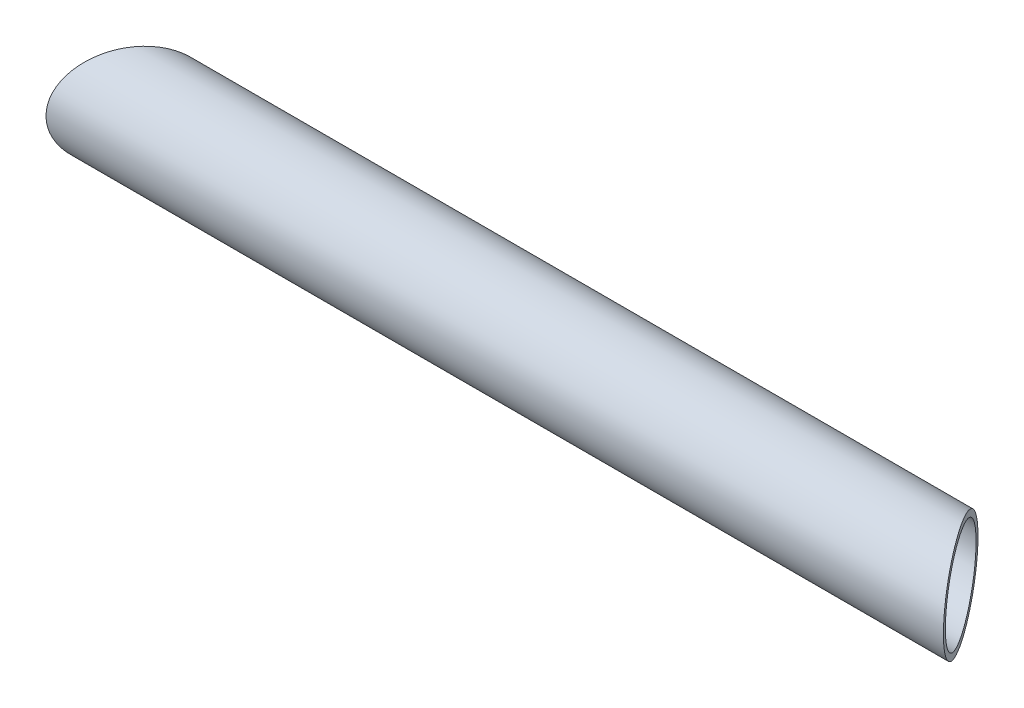
ISO-10303-21;
HEADER;
FILE_DESCRIPTION(('STEP AP214'),'2;1');
FILE_NAME('part.step','',(''),(''),'','','');
FILE_SCHEMA(('AUTOMOTIVE_DESIGN { 1 0 10303 214 1 1 1 1 }'));
ENDSEC;
DATA;
#1=APPLICATION_CONTEXT('core data for automotive mechanical design processes');
#2=APPLICATION_PROTOCOL_DEFINITION('international standard','automotive_design',2000,#1);
#3=PRODUCT_CONTEXT('',#1,'mechanical');
#4=PRODUCT('Part','Part','',(#3));
#5=PRODUCT_RELATED_PRODUCT_CATEGORY('part','',(#4));
#6=PRODUCT_DEFINITION_FORMATION('','',#4);
#7=PRODUCT_DEFINITION_CONTEXT('part definition',#1,'design');
#8=PRODUCT_DEFINITION('design','',#6,#7);
#9=PRODUCT_DEFINITION_SHAPE('','',#8);
#10=(LENGTH_UNIT() NAMED_UNIT(*) SI_UNIT(.MILLI.,.METRE.));
#11=(NAMED_UNIT(*) PLANE_ANGLE_UNIT() SI_UNIT($,.RADIAN.));
#12=(NAMED_UNIT(*) SI_UNIT($,.STERADIAN.) SOLID_ANGLE_UNIT());
#13=UNCERTAINTY_MEASURE_WITH_UNIT(LENGTH_MEASURE(1.E-05),#10,'distance_accuracy_value','');
#14=(GEOMETRIC_REPRESENTATION_CONTEXT(3) GLOBAL_UNCERTAINTY_ASSIGNED_CONTEXT((#13)) GLOBAL_UNIT_ASSIGNED_CONTEXT((#10,
#11,#12)) REPRESENTATION_CONTEXT('',''));
#15=CARTESIAN_POINT('',(0.,0.,0.));
#16=DIRECTION('',(0.,0.,1.));
#17=DIRECTION('',(1.,0.,0.));
#18=AXIS2_PLACEMENT_3D('',#15,#16,#17);
#19=CARTESIAN_POINT('',(-65.,0.,0.));
#20=DIRECTION('',(1.,0.,0.));
#21=DIRECTION('',(0.,0.,-1.));
#22=AXIS2_PLACEMENT_3D('',#19,#20,#21);
#23=CYLINDRICAL_SURFACE('',#22,7.1);
#24=CARTESIAN_POINT('',(-65.,0.,0.));
#25=DIRECTION('',(-0.834008585191079,0.,-0.551751465632466));
#26=DIRECTION('',(0.551751465632466,0.,-0.834008585191079));
#27=AXIS2_PLACEMENT_3D('',#24,#25,#26);
#28=ELLIPSE('',#27,8.51310181462139,7.1);
#29=CARTESIAN_POINT('',(-60.3028835967043,0.,-7.09999999999998));
#30=VERTEX_POINT('',#29);
#31=EDGE_CURVE('E53',#30,#30,#28,.T.);
#32=ORIENTED_EDGE('',*,*,#31,.T.);
#33=EDGE_LOOP('',(#32));
#34=FACE_BOUND('',#33,.T.);
#35=CARTESIAN_POINT('',(65.,0.,0.));
#36=DIRECTION('',(0.834008585191079,0.,-0.551751465632466));
#37=DIRECTION('',(0.551751465632466,0.,0.834008585191079));
#38=AXIS2_PLACEMENT_3D('',#35,#36,#37);
#39=ELLIPSE('',#38,8.51310181462139,7.1);
#40=CARTESIAN_POINT('',(69.6971164032958,0.,7.10000000000001));
#41=VERTEX_POINT('',#40);
#42=EDGE_CURVE('E43',#41,#41,#39,.T.);
#43=ORIENTED_EDGE('',*,*,#42,.T.);
#44=EDGE_LOOP('',(#43));
#45=FACE_BOUND('',#44,.T.);
#46=ADVANCED_FACE('F39',(#34,#45),#23,.F.);
#47=CARTESIAN_POINT('',(-65.,0.,0.));
#48=DIRECTION('',(1.,0.,0.));
#49=DIRECTION('',(0.,0.,-1.));
#50=AXIS2_PLACEMENT_3D('',#47,#48,#49);
#51=CYLINDRICAL_SURFACE('',#50,8.);
#52=CARTESIAN_POINT('',(-65.,0.,0.));
#53=DIRECTION('',(-0.834008585191079,0.,-0.551751465632466));
#54=DIRECTION('',(0.551751465632466,0.,-0.834008585191079));
#55=AXIS2_PLACEMENT_3D('',#52,#53,#54);
#56=ELLIPSE('',#55,9.5922273967565,8.);
#57=CARTESIAN_POINT('',(-59.7074744751597,0.,-7.99999999999999));
#58=VERTEX_POINT('',#57);
#59=EDGE_CURVE('E47',#58,#58,#56,.T.);
#60=ORIENTED_EDGE('',*,*,#59,.F.);
#61=EDGE_LOOP('',(#60));
#62=FACE_BOUND('',#61,.T.);
#63=CARTESIAN_POINT('',(65.,0.,0.));
#64=DIRECTION('',(0.834008585191079,0.,-0.551751465632466));
#65=DIRECTION('',(0.551751465632466,0.,0.834008585191079));
#66=AXIS2_PLACEMENT_3D('',#63,#64,#65);
#67=ELLIPSE('',#66,9.59222739675651,8.);
#68=CARTESIAN_POINT('',(70.2925255248403,0.,8.00000000000002));
#69=VERTEX_POINT('',#68);
#70=EDGE_CURVE('E10',#69,#69,#67,.T.);
#71=ORIENTED_EDGE('',*,*,#70,.F.);
#72=EDGE_LOOP('',(#71));
#73=FACE_BOUND('',#72,.T.);
#74=ADVANCED_FACE('F67',(#62,#73),#51,.T.);
#75=CARTESIAN_POINT('',(-65.,0.,0.));
#76=DIRECTION('',(-0.834008585191079,0.,-0.551751465632466));
#77=DIRECTION('',(-0.551751465632466,0.,0.834008585191079));
#78=AXIS2_PLACEMENT_3D('',#75,#76,#77);
#79=PLANE('',#78);
#80=ORIENTED_EDGE('',*,*,#31,.F.);
#81=EDGE_LOOP('',(#80));
#82=FACE_BOUND('',#81,.T.);
#83=ORIENTED_EDGE('',*,*,#59,.T.);
#84=EDGE_LOOP('',(#83));
#85=FACE_BOUND('',#84,.T.);
#86=ADVANCED_FACE('F62',(#82,#85),#79,.T.);
#87=CARTESIAN_POINT('',(65.,0.,0.));
#88=DIRECTION('',(0.834008585191079,0.,-0.551751465632466));
#89=DIRECTION('',(-0.551751465632466,0.,-0.834008585191079));
#90=AXIS2_PLACEMENT_3D('',#87,#88,#89);
#91=PLANE('',#90);
#92=ORIENTED_EDGE('',*,*,#42,.F.);
#93=EDGE_LOOP('',(#92));
#94=FACE_BOUND('',#93,.T.);
#95=ORIENTED_EDGE('',*,*,#70,.T.);
#96=EDGE_LOOP('',(#95));
#97=FACE_BOUND('',#96,.T.);
#98=ADVANCED_FACE('F41',(#94,#97),#91,.T.);
#99=CLOSED_SHELL('',(#46,#74,#86,#98));
#100=MANIFOLD_SOLID_BREP('B2',#99);
#101=ADVANCED_BREP_SHAPE_REPRESENTATION('',(#18,#100),#14);
#102=SHAPE_DEFINITION_REPRESENTATION(#9,#101);
ENDSEC;
END-ISO-10303-21;
